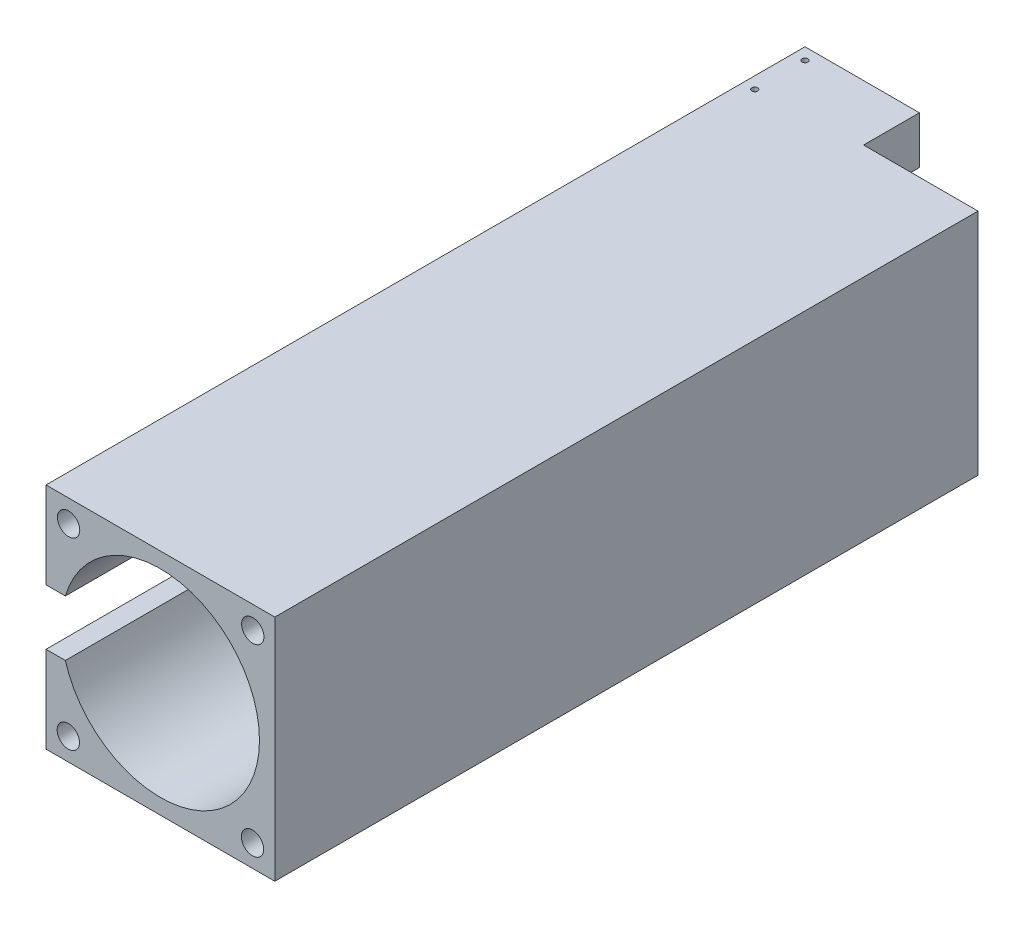
ISO-10303-21;
HEADER;
FILE_DESCRIPTION(('STEP AP214'),'2;1');
FILE_NAME('part.step','',(''),(''),'','','');
FILE_SCHEMA(('AUTOMOTIVE_DESIGN { 1 0 10303 214 1 1 1 1 }'));
ENDSEC;
DATA;
#1=APPLICATION_CONTEXT('core data for automotive mechanical design processes');
#2=APPLICATION_PROTOCOL_DEFINITION('international standard','automotive_design',2000,#1);
#3=PRODUCT_CONTEXT('',#1,'mechanical');
#4=PRODUCT('Part','Part','',(#3));
#5=PRODUCT_RELATED_PRODUCT_CATEGORY('part','',(#4));
#6=PRODUCT_DEFINITION_FORMATION('','',#4);
#7=PRODUCT_DEFINITION_CONTEXT('part definition',#1,'design');
#8=PRODUCT_DEFINITION('design','',#6,#7);
#9=PRODUCT_DEFINITION_SHAPE('','',#8);
#10=(LENGTH_UNIT() NAMED_UNIT(*) SI_UNIT(.MILLI.,.METRE.));
#11=(NAMED_UNIT(*) PLANE_ANGLE_UNIT() SI_UNIT($,.RADIAN.));
#12=(NAMED_UNIT(*) SI_UNIT($,.STERADIAN.) SOLID_ANGLE_UNIT());
#13=UNCERTAINTY_MEASURE_WITH_UNIT(LENGTH_MEASURE(1.E-05),#10,'distance_accuracy_value','');
#14=(GEOMETRIC_REPRESENTATION_CONTEXT(3) GLOBAL_UNCERTAINTY_ASSIGNED_CONTEXT((#13)) GLOBAL_UNIT_ASSIGNED_CONTEXT((#10,
#11,#12)) REPRESENTATION_CONTEXT('',''));
#15=CARTESIAN_POINT('',(0.,0.,0.));
#16=DIRECTION('',(0.,0.,1.));
#17=DIRECTION('',(1.,0.,0.));
#18=AXIS2_PLACEMENT_3D('',#15,#16,#17);
#19=CARTESIAN_POINT('',(-41.,-41.,245.));
#20=DIRECTION('',(1.,0.,0.));
#21=DIRECTION('',(0.,0.,-1.));
#22=AXIS2_PLACEMENT_3D('',#19,#20,#21);
#23=PLANE('',#22);
#24=DIRECTION('',(0.,0.,1.));
#25=VECTOR('',#24,1.);
#26=CARTESIAN_POINT('',(-41.,24.,-27.));
#27=LINE('',#26,#25);
#28=CARTESIAN_POINT('',(-41.,24.,-27.));
#29=VERTEX_POINT('',#28);
#30=CARTESIAN_POINT('',(-41.,24.,-7.));
#31=VERTEX_POINT('',#30);
#32=EDGE_CURVE('E430',#29,#31,#27,.T.);
#33=ORIENTED_EDGE('',*,*,#32,.T.);
#34=DIRECTION('',(0.,-1.,0.));
#35=VECTOR('',#34,1.);
#36=CARTESIAN_POINT('',(-41.,-41.,-7.));
#37=LINE('',#36,#35);
#38=CARTESIAN_POINT('',(-41.,-41.,-7.));
#39=VERTEX_POINT('',#38);
#40=EDGE_CURVE('E144',#31,#39,#37,.T.);
#41=ORIENTED_EDGE('',*,*,#40,.T.);
#42=DIRECTION('',(0.,0.,-1.));
#43=VECTOR('',#42,1.);
#44=CARTESIAN_POINT('',(-41.,-41.,245.));
#45=LINE('',#44,#43);
#46=CARTESIAN_POINT('',(-41.,-41.,245.));
#47=VERTEX_POINT('',#46);
#48=EDGE_CURVE('E232',#47,#39,#45,.T.);
#49=ORIENTED_EDGE('',*,*,#48,.F.);
#50=DIRECTION('',(0.,-1.,0.));
#51=VECTOR('',#50,1.);
#52=CARTESIAN_POINT('',(-41.,-41.,245.));
#53=LINE('',#52,#51);
#54=CARTESIAN_POINT('',(-41.,-10.,245.));
#55=VERTEX_POINT('',#54);
#56=EDGE_CURVE('E211',#55,#47,#53,.T.);
#57=ORIENTED_EDGE('',*,*,#56,.F.);
#58=DIRECTION('',(0.,0.,1.));
#59=VECTOR('',#58,1.);
#60=CARTESIAN_POINT('',(-41.,-10.,-21.540659228538));
#61=LINE('',#60,#59);
#62=CARTESIAN_POINT('',(-41.,-10.,0.));
#63=VERTEX_POINT('',#62);
#64=EDGE_CURVE('E192',#63,#55,#61,.T.);
#65=ORIENTED_EDGE('',*,*,#64,.F.);
#66=DIRECTION('',(0.,-1.,0.));
#67=VECTOR('',#66,1.);
#68=CARTESIAN_POINT('',(-41.,10.,0.));
#69=LINE('',#68,#67);
#70=CARTESIAN_POINT('',(-41.,10.,0.));
#71=VERTEX_POINT('',#70);
#72=EDGE_CURVE('E189',#71,#63,#69,.T.);
#73=ORIENTED_EDGE('',*,*,#72,.F.);
#74=DIRECTION('',(0.,0.,1.));
#75=VECTOR('',#74,1.);
#76=CARTESIAN_POINT('',(-41.,10.,-21.540659228538));
#77=LINE('',#76,#75);
#78=CARTESIAN_POINT('',(-41.,10.,245.));
#79=VERTEX_POINT('',#78);
#80=EDGE_CURVE('E193',#71,#79,#77,.T.);
#81=ORIENTED_EDGE('',*,*,#80,.T.);
#82=CARTESIAN_POINT('',(-41.,41.,245.));
#83=VERTEX_POINT('',#82);
#84=EDGE_CURVE('E214',#83,#79,#53,.T.);
#85=ORIENTED_EDGE('',*,*,#84,.F.);
#86=DIRECTION('',(0.,0.,-1.));
#87=VECTOR('',#86,1.);
#88=CARTESIAN_POINT('',(-41.,41.,245.));
#89=LINE('',#88,#87);
#90=CARTESIAN_POINT('',(-41.,41.,-27.));
#91=VERTEX_POINT('',#90);
#92=EDGE_CURVE('E223',#83,#91,#89,.T.);
#93=ORIENTED_EDGE('',*,*,#92,.T.);
#94=DIRECTION('',(0.,1.,0.));
#95=VECTOR('',#94,1.);
#96=CARTESIAN_POINT('',(-41.,41.,-27.));
#97=LINE('',#96,#95);
#98=EDGE_CURVE('E202',#29,#91,#97,.T.);
#99=ORIENTED_EDGE('',*,*,#98,.F.);
#100=EDGE_LOOP('',(#33,#41,#49,#57,#65,#73,#81,#85,#93,#99));
#101=FACE_BOUND('',#100,.T.);
#102=ADVANCED_FACE('F39',(#101),#23,.F.);
#103=CARTESIAN_POINT('',(-41.,-41.,245.));
#104=DIRECTION('',(0.,1.,0.));
#105=DIRECTION('',(0.,0.,1.));
#106=AXIS2_PLACEMENT_3D('',#103,#104,#105);
#107=PLANE('',#106);
#108=DIRECTION('',(-1.,0.,0.));
#109=VECTOR('',#108,1.);
#110=CARTESIAN_POINT('',(41.001,-41.,-7.));
#111=LINE('',#110,#109);
#112=CARTESIAN_POINT('',(41.,-41.,-7.));
#113=VERTEX_POINT('',#112);
#114=EDGE_CURVE('E146',#113,#39,#111,.T.);
#115=ORIENTED_EDGE('',*,*,#114,.F.);
#116=DIRECTION('',(0.,0.,-1.));
#117=VECTOR('',#116,1.);
#118=CARTESIAN_POINT('',(41.,-41.,245.));
#119=LINE('',#118,#117);
#120=CARTESIAN_POINT('',(41.,-41.,245.));
#121=VERTEX_POINT('',#120);
#122=EDGE_CURVE('E229',#121,#113,#119,.T.);
#123=ORIENTED_EDGE('',*,*,#122,.F.);
#124=DIRECTION('',(1.,0.,0.));
#125=VECTOR('',#124,1.);
#126=CARTESIAN_POINT('',(-41.,-41.,245.));
#127=LINE('',#126,#125);
#128=EDGE_CURVE('E217',#47,#121,#127,.T.);
#129=ORIENTED_EDGE('',*,*,#128,.F.);
#130=ORIENTED_EDGE('',*,*,#48,.T.);
#131=EDGE_LOOP('',(#115,#123,#129,#130));
#132=FACE_BOUND('',#131,.T.);
#133=ADVANCED_FACE('F344',(#132),#107,.F.);
#134=CARTESIAN_POINT('',(41.,-41.,245.));
#135=DIRECTION('',(-1.,0.,0.));
#136=DIRECTION('',(0.,0.,1.));
#137=AXIS2_PLACEMENT_3D('',#134,#135,#136);
#138=PLANE('',#137);
#139=DIRECTION('',(0.,1.,0.));
#140=VECTOR('',#139,1.);
#141=CARTESIAN_POINT('',(41.,-41.,-7.));
#142=LINE('',#141,#140);
#143=CARTESIAN_POINT('',(41.,41.,-7.));
#144=VERTEX_POINT('',#143);
#145=EDGE_CURVE('E133',#113,#144,#142,.T.);
#146=ORIENTED_EDGE('',*,*,#145,.T.);
#147=DIRECTION('',(0.,0.,-1.));
#148=VECTOR('',#147,1.);
#149=CARTESIAN_POINT('',(41.,41.,245.));
#150=LINE('',#149,#148);
#151=CARTESIAN_POINT('',(41.,41.,245.));
#152=VERTEX_POINT('',#151);
#153=EDGE_CURVE('E226',#152,#144,#150,.T.);
#154=ORIENTED_EDGE('',*,*,#153,.F.);
#155=DIRECTION('',(0.,1.,0.));
#156=VECTOR('',#155,1.);
#157=CARTESIAN_POINT('',(41.,-41.,245.));
#158=LINE('',#157,#156);
#159=EDGE_CURVE('E219',#121,#152,#158,.T.);
#160=ORIENTED_EDGE('',*,*,#159,.F.);
#161=ORIENTED_EDGE('',*,*,#122,.T.);
#162=EDGE_LOOP('',(#146,#154,#160,#161));
#163=FACE_BOUND('',#162,.T.);
#164=ADVANCED_FACE('F350',(#163),#138,.F.);
#165=CARTESIAN_POINT('',(0.,0.,-27.));
#166=DIRECTION('',(0.,0.,-1.));
#167=DIRECTION('',(-1.,0.,0.));
#168=AXIS2_PLACEMENT_3D('',#165,#166,#167);
#169=PLANE('',#168);
#170=DIRECTION('',(0.,1.,0.));
#171=VECTOR('',#170,1.);
#172=CARTESIAN_POINT('',(0.,-41.001,-27.));
#173=LINE('',#172,#171);
#174=CARTESIAN_POINT('',(0.,24.,-27.));
#175=VERTEX_POINT('',#174);
#176=CARTESIAN_POINT('',(0.,41.,-27.));
#177=VERTEX_POINT('',#176);
#178=EDGE_CURVE('E134',#175,#177,#173,.T.);
#179=ORIENTED_EDGE('',*,*,#178,.F.);
#180=DIRECTION('',(-1.,0.,0.));
#181=VECTOR('',#180,1.);
#182=CARTESIAN_POINT('',(41.001,24.,-27.));
#183=LINE('',#182,#181);
#184=EDGE_CURVE('E55',#175,#29,#183,.T.);
#185=ORIENTED_EDGE('',*,*,#184,.T.);
#186=ORIENTED_EDGE('',*,*,#98,.T.);
#187=DIRECTION('',(1.,0.,0.));
#188=VECTOR('',#187,1.);
#189=CARTESIAN_POINT('',(41.,41.,-27.));
#190=LINE('',#189,#188);
#191=EDGE_CURVE('E204',#91,#177,#190,.T.);
#192=ORIENTED_EDGE('',*,*,#191,.T.);
#193=EDGE_LOOP('',(#179,#185,#186,#192));
#194=FACE_BOUND('',#193,.T.);
#195=ADVANCED_FACE('F404',(#194),#169,.T.);
#196=CARTESIAN_POINT('',(0.,0.,245.));
#197=DIRECTION('',(0.,0.,-1.));
#198=DIRECTION('',(-1.,0.,0.));
#199=AXIS2_PLACEMENT_3D('',#196,#197,#198);
#200=PLANE('',#199);
#201=CARTESIAN_POINT('',(-32.9999999999981,-33.,245.));
#202=DIRECTION('',(0.,0.,1.));
#203=DIRECTION('',(1.,0.,0.));
#204=AXIS2_PLACEMENT_3D('',#201,#202,#203);
#205=CIRCLE('',#204,4.000000000001);
#206=CARTESIAN_POINT('',(-28.9999999999971,-33.,245.));
#207=VERTEX_POINT('',#206);
#208=EDGE_CURVE('E162',#207,#207,#205,.T.);
#209=ORIENTED_EDGE('',*,*,#208,.F.);
#210=EDGE_LOOP('',(#209));
#211=FACE_BOUND('',#210,.T.);
#212=CARTESIAN_POINT('',(33.0000000000019,-33.0999999999982,245.));
#213=DIRECTION('',(0.,0.,1.));
#214=DIRECTION('',(1.,0.,0.));
#215=AXIS2_PLACEMENT_3D('',#212,#213,#214);
#216=CIRCLE('',#215,4.00000000000001);
#217=CARTESIAN_POINT('',(37.0000000000019,-33.0999999999982,245.));
#218=VERTEX_POINT('',#217);
#219=EDGE_CURVE('E175',#218,#218,#216,.T.);
#220=ORIENTED_EDGE('',*,*,#219,.F.);
#221=EDGE_LOOP('',(#220));
#222=FACE_BOUND('',#221,.T.);
#223=CARTESIAN_POINT('',(33.1000000000001,32.9000000000018,245.));
#224=DIRECTION('',(0.,0.,1.));
#225=DIRECTION('',(1.,0.,0.));
#226=AXIS2_PLACEMENT_3D('',#223,#224,#225);
#227=CIRCLE('',#226,4.);
#228=CARTESIAN_POINT('',(37.1000000000001,32.9000000000018,245.));
#229=VERTEX_POINT('',#228);
#230=EDGE_CURVE('E171',#229,#229,#227,.T.);
#231=ORIENTED_EDGE('',*,*,#230,.F.);
#232=EDGE_LOOP('',(#231));
#233=FACE_BOUND('',#232,.T.);
#234=CARTESIAN_POINT('',(-32.9,33.,245.));
#235=DIRECTION('',(0.,0.,1.));
#236=DIRECTION('',(1.,0.,0.));
#237=AXIS2_PLACEMENT_3D('',#234,#235,#236);
#238=CIRCLE('',#237,4.);
#239=CARTESIAN_POINT('',(-28.9,33.,245.));
#240=VERTEX_POINT('',#239);
#241=EDGE_CURVE('E174',#240,#240,#238,.T.);
#242=ORIENTED_EDGE('',*,*,#241,.F.);
#243=EDGE_LOOP('',(#242));
#244=FACE_BOUND('',#243,.T.);
#245=CARTESIAN_POINT('',(0.,0.,245.));
#246=DIRECTION('',(0.,0.,1.));
#247=DIRECTION('',(1.,0.,0.));
#248=AXIS2_PLACEMENT_3D('',#245,#246,#247);
#249=CIRCLE('',#248,35.5);
#250=CARTESIAN_POINT('',(-34.0624426605022,-10.,245.));
#251=VERTEX_POINT('',#250);
#252=CARTESIAN_POINT('',(-34.0624426605022,10.,245.));
#253=VERTEX_POINT('',#252);
#254=EDGE_CURVE('E208',#251,#253,#249,.T.);
#255=ORIENTED_EDGE('',*,*,#254,.F.);
#256=DIRECTION('',(1.,0.,0.));
#257=VECTOR('',#256,1.);
#258=CARTESIAN_POINT('',(-41.,-10.,245.));
#259=LINE('',#258,#257);
#260=EDGE_CURVE('E182',#55,#251,#259,.T.);
#261=ORIENTED_EDGE('',*,*,#260,.F.);
#262=ORIENTED_EDGE('',*,*,#56,.T.);
#263=ORIENTED_EDGE('',*,*,#128,.T.);
#264=ORIENTED_EDGE('',*,*,#159,.T.);
#265=DIRECTION('',(-1.,0.,0.));
#266=VECTOR('',#265,1.);
#267=CARTESIAN_POINT('',(-41.,41.,245.));
#268=LINE('',#267,#266);
#269=EDGE_CURVE('E221',#152,#83,#268,.T.);
#270=ORIENTED_EDGE('',*,*,#269,.T.);
#271=ORIENTED_EDGE('',*,*,#84,.T.);
#272=DIRECTION('',(-1.,0.,0.));
#273=VECTOR('',#272,1.);
#274=CARTESIAN_POINT('',(-41.,10.,245.));
#275=LINE('',#274,#273);
#276=EDGE_CURVE('E183',#253,#79,#275,.T.);
#277=ORIENTED_EDGE('',*,*,#276,.F.);
#278=EDGE_LOOP('',(#255,#261,#262,#263,#264,#270,#271,#277));
#279=FACE_BOUND('',#278,.T.);
#280=ADVANCED_FACE('F407',(#211,#222,#233,#244,#279),#200,.F.);
#281=CARTESIAN_POINT('',(-41.,41.,245.));
#282=DIRECTION('',(0.,-1.,0.));
#283=DIRECTION('',(0.,0.,-1.));
#284=AXIS2_PLACEMENT_3D('',#281,#282,#283);
#285=PLANE('',#284);
#286=CARTESIAN_POINT('',(-36.75,41.,-22.75));
#287=DIRECTION('',(0.,1.,0.));
#288=DIRECTION('',(0.,0.,1.));
#289=AXIS2_PLACEMENT_3D('',#286,#287,#288);
#290=CIRCLE('',#289,1.05);
#291=CARTESIAN_POINT('',(-36.75,41.,-21.7));
#292=VERTEX_POINT('',#291);
#293=EDGE_CURVE('E163',#292,#292,#290,.T.);
#294=ORIENTED_EDGE('',*,*,#293,.F.);
#295=EDGE_LOOP('',(#294));
#296=FACE_BOUND('',#295,.T.);
#297=CARTESIAN_POINT('',(-36.75,41.,-4.74999999999999));
#298=DIRECTION('',(0.,1.,0.));
#299=DIRECTION('',(0.,0.,1.));
#300=AXIS2_PLACEMENT_3D('',#297,#298,#299);
#301=CIRCLE('',#300,1.05);
#302=CARTESIAN_POINT('',(-36.75,41.,-3.69999999999999));
#303=VERTEX_POINT('',#302);
#304=EDGE_CURVE('E158',#303,#303,#301,.T.);
#305=ORIENTED_EDGE('',*,*,#304,.F.);
#306=EDGE_LOOP('',(#305));
#307=FACE_BOUND('',#306,.T.);
#308=ORIENTED_EDGE('',*,*,#153,.T.);
#309=DIRECTION('',(1.,0.,0.));
#310=VECTOR('',#309,1.);
#311=CARTESIAN_POINT('',(41.,41.,-7.));
#312=LINE('',#311,#310);
#313=CARTESIAN_POINT('',(0.,41.,-7.));
#314=VERTEX_POINT('',#313);
#315=EDGE_CURVE('E432',#314,#144,#312,.T.);
#316=ORIENTED_EDGE('',*,*,#315,.F.);
#317=DIRECTION('',(0.,0.,1.));
#318=VECTOR('',#317,1.);
#319=CARTESIAN_POINT('',(0.,41.,-27.));
#320=LINE('',#319,#318);
#321=EDGE_CURVE('E128',#177,#314,#320,.T.);
#322=ORIENTED_EDGE('',*,*,#321,.F.);
#323=ORIENTED_EDGE('',*,*,#191,.F.);
#324=ORIENTED_EDGE('',*,*,#92,.F.);
#325=ORIENTED_EDGE('',*,*,#269,.F.);
#326=EDGE_LOOP('',(#308,#316,#322,#323,#324,#325));
#327=FACE_BOUND('',#326,.T.);
#328=ADVANCED_FACE('F414',(#296,#307,#327),#285,.F.);
#329=CARTESIAN_POINT('',(0.,0.,245.));
#330=DIRECTION('',(0.,0.,-1.));
#331=DIRECTION('',(-1.,0.,0.));
#332=AXIS2_PLACEMENT_3D('',#329,#330,#331);
#333=CYLINDRICAL_SURFACE('',#332,35.5);
#334=DIRECTION('',(0.,0.,-1.));
#335=VECTOR('',#334,1.);
#336=CARTESIAN_POINT('',(-34.0624426605022,-10.,245.));
#337=LINE('',#336,#335);
#338=CARTESIAN_POINT('',(-34.0624426605022,-10.,0.));
#339=VERTEX_POINT('',#338);
#340=EDGE_CURVE('E200',#251,#339,#337,.T.);
#341=ORIENTED_EDGE('',*,*,#340,.F.);
#342=ORIENTED_EDGE('',*,*,#254,.T.);
#343=DIRECTION('',(0.,0.,-1.));
#344=VECTOR('',#343,1.);
#345=CARTESIAN_POINT('',(-34.0624426605022,10.,245.));
#346=LINE('',#345,#344);
#347=CARTESIAN_POINT('',(-34.0624426605022,10.,0.));
#348=VERTEX_POINT('',#347);
#349=EDGE_CURVE('E198',#348,#253,#346,.F.);
#350=ORIENTED_EDGE('',*,*,#349,.F.);
#351=CARTESIAN_POINT('',(0.,0.,0.));
#352=DIRECTION('',(0.,0.,1.));
#353=DIRECTION('',(1.,0.,0.));
#354=AXIS2_PLACEMENT_3D('',#351,#352,#353);
#355=CIRCLE('',#354,35.5);
#356=EDGE_CURVE('E207',#339,#348,#355,.T.);
#357=ORIENTED_EDGE('',*,*,#356,.F.);
#358=EDGE_LOOP('',(#341,#342,#350,#357));
#359=FACE_BOUND('',#358,.T.);
#360=ADVANCED_FACE('F410',(#359),#333,.F.);
#361=CARTESIAN_POINT('',(0.,0.,0.));
#362=DIRECTION('',(0.,0.,-1.));
#363=DIRECTION('',(-1.,0.,0.));
#364=AXIS2_PLACEMENT_3D('',#361,#362,#363);
#365=PLANE('',#364);
#366=ORIENTED_EDGE('',*,*,#356,.T.);
#367=DIRECTION('',(-1.,0.,0.));
#368=VECTOR('',#367,1.);
#369=CARTESIAN_POINT('',(-41.,10.,0.));
#370=LINE('',#369,#368);
#371=EDGE_CURVE('E63',#348,#71,#370,.T.);
#372=ORIENTED_EDGE('',*,*,#371,.T.);
#373=ORIENTED_EDGE('',*,*,#72,.T.);
#374=DIRECTION('',(1.,0.,0.));
#375=VECTOR('',#374,1.);
#376=CARTESIAN_POINT('',(-41.,-10.,0.));
#377=LINE('',#376,#375);
#378=EDGE_CURVE('E185',#63,#339,#377,.T.);
#379=ORIENTED_EDGE('',*,*,#378,.T.);
#380=EDGE_LOOP('',(#366,#372,#373,#379));
#381=FACE_BOUND('',#380,.T.);
#382=ADVANCED_FACE('F402',(#381),#365,.F.);
#383=CARTESIAN_POINT('',(-41.,-10.,-21.540659228538));
#384=DIRECTION('',(0.,-1.,0.));
#385=DIRECTION('',(0.,0.,-1.));
#386=AXIS2_PLACEMENT_3D('',#383,#384,#385);
#387=PLANE('',#386);
#388=ORIENTED_EDGE('',*,*,#340,.T.);
#389=ORIENTED_EDGE('',*,*,#378,.F.);
#390=ORIENTED_EDGE('',*,*,#64,.T.);
#391=ORIENTED_EDGE('',*,*,#260,.T.);
#392=EDGE_LOOP('',(#388,#389,#390,#391));
#393=FACE_BOUND('',#392,.T.);
#394=ADVANCED_FACE('F399',(#393),#387,.F.);
#395=CARTESIAN_POINT('',(-41.,10.,-21.540659228538));
#396=DIRECTION('',(0.,1.,0.));
#397=DIRECTION('',(0.,0.,1.));
#398=AXIS2_PLACEMENT_3D('',#395,#396,#397);
#399=PLANE('',#398);
#400=ORIENTED_EDGE('',*,*,#349,.T.);
#401=ORIENTED_EDGE('',*,*,#276,.T.);
#402=ORIENTED_EDGE('',*,*,#80,.F.);
#403=ORIENTED_EDGE('',*,*,#371,.F.);
#404=EDGE_LOOP('',(#400,#401,#402,#403));
#405=FACE_BOUND('',#404,.T.);
#406=ADVANCED_FACE('F395',(#405),#399,.F.);
#407=CARTESIAN_POINT('',(-32.9,33.,225.));
#408=DIRECTION('',(0.,0.,1.));
#409=DIRECTION('',(1.,0.,0.));
#410=AXIS2_PLACEMENT_3D('',#407,#408,#409);
#411=CYLINDRICAL_SURFACE('',#410,4.);
#412=CARTESIAN_POINT('',(-32.9,33.,228.));
#413=DIRECTION('',(0.,0.,1.));
#414=DIRECTION('',(1.,0.,0.));
#415=AXIS2_PLACEMENT_3D('',#412,#413,#414);
#416=CIRCLE('',#415,4.);
#417=CARTESIAN_POINT('',(-28.9,33.,228.));
#418=VERTEX_POINT('',#417);
#419=EDGE_CURVE('E238',#418,#418,#416,.F.);
#420=ORIENTED_EDGE('',*,*,#419,.T.);
#421=EDGE_LOOP('',(#420));
#422=FACE_BOUND('',#421,.T.);
#423=ORIENTED_EDGE('',*,*,#241,.T.);
#424=EDGE_LOOP('',(#423));
#425=FACE_BOUND('',#424,.T.);
#426=ADVANCED_FACE('F391',(#422,#425),#411,.F.);
#427=CARTESIAN_POINT('',(-32.9,33.,225.));
#428=DIRECTION('',(0.,0.,1.));
#429=DIRECTION('',(1.,0.,0.));
#430=AXIS2_PLACEMENT_3D('',#427,#428,#429);
#431=PLANE('',#430);
#432=CARTESIAN_POINT('',(-32.9,33.,225.));
#433=DIRECTION('',(0.,0.,1.));
#434=DIRECTION('',(1.,0.,0.));
#435=AXIS2_PLACEMENT_3D('',#432,#433,#434);
#436=CIRCLE('',#435,1.);
#437=CARTESIAN_POINT('',(-31.9,33.,225.));
#438=VERTEX_POINT('',#437);
#439=EDGE_CURVE('E235',#438,#438,#436,.T.);
#440=ORIENTED_EDGE('',*,*,#439,.T.);
#441=EDGE_LOOP('',(#440));
#442=FACE_BOUND('',#441,.T.);
#443=ADVANCED_FACE('F387',(#442),#431,.T.);
#444=CARTESIAN_POINT('',(33.1000000000001,32.9000000000018,225.));
#445=DIRECTION('',(0.,0.,1.));
#446=DIRECTION('',(1.,0.,0.));
#447=AXIS2_PLACEMENT_3D('',#444,#445,#446);
#448=CYLINDRICAL_SURFACE('',#447,4.);
#449=CARTESIAN_POINT('',(33.1000000000001,32.9000000000018,228.));
#450=DIRECTION('',(0.,0.,1.));
#451=DIRECTION('',(1.,0.,0.));
#452=AXIS2_PLACEMENT_3D('',#449,#450,#451);
#453=CIRCLE('',#452,4.);
#454=CARTESIAN_POINT('',(37.1000000000001,32.9000000000018,228.));
#455=VERTEX_POINT('',#454);
#456=EDGE_CURVE('E244',#455,#455,#453,.F.);
#457=ORIENTED_EDGE('',*,*,#456,.T.);
#458=EDGE_LOOP('',(#457));
#459=FACE_BOUND('',#458,.T.);
#460=ORIENTED_EDGE('',*,*,#230,.T.);
#461=EDGE_LOOP('',(#460));
#462=FACE_BOUND('',#461,.T.);
#463=ADVANCED_FACE('F390',(#459,#462),#448,.F.);
#464=CARTESIAN_POINT('',(33.1000000000001,32.9000000000018,225.));
#465=DIRECTION('',(0.,0.,1.));
#466=DIRECTION('',(1.,0.,0.));
#467=AXIS2_PLACEMENT_3D('',#464,#465,#466);
#468=PLANE('',#467);
#469=CARTESIAN_POINT('',(33.1000000000001,32.9000000000018,225.));
#470=DIRECTION('',(0.,0.,1.));
#471=DIRECTION('',(1.,0.,0.));
#472=AXIS2_PLACEMENT_3D('',#469,#470,#471);
#473=CIRCLE('',#472,0.999999999999997);
#474=CARTESIAN_POINT('',(34.1,32.9000000000018,225.));
#475=VERTEX_POINT('',#474);
#476=EDGE_CURVE('E241',#475,#475,#473,.T.);
#477=ORIENTED_EDGE('',*,*,#476,.T.);
#478=EDGE_LOOP('',(#477));
#479=FACE_BOUND('',#478,.T.);
#480=ADVANCED_FACE('F536',(#479),#468,.T.);
#481=CARTESIAN_POINT('',(33.0000000000019,-33.0999999999982,225.));
#482=DIRECTION('',(0.,0.,1.));
#483=DIRECTION('',(1.,0.,0.));
#484=AXIS2_PLACEMENT_3D('',#481,#482,#483);
#485=CYLINDRICAL_SURFACE('',#484,4.00000000000001);
#486=CARTESIAN_POINT('',(33.0000000000019,-33.0999999999982,228.));
#487=DIRECTION('',(0.,0.,1.));
#488=DIRECTION('',(1.,0.,0.));
#489=AXIS2_PLACEMENT_3D('',#486,#487,#488);
#490=CIRCLE('',#489,4.00000000000001);
#491=CARTESIAN_POINT('',(37.0000000000019,-33.0999999999982,228.));
#492=VERTEX_POINT('',#491);
#493=EDGE_CURVE('E256',#492,#492,#490,.F.);
#494=ORIENTED_EDGE('',*,*,#493,.T.);
#495=EDGE_LOOP('',(#494));
#496=FACE_BOUND('',#495,.T.);
#497=ORIENTED_EDGE('',*,*,#219,.T.);
#498=EDGE_LOOP('',(#497));
#499=FACE_BOUND('',#498,.T.);
#500=ADVANCED_FACE('F384',(#496,#499),#485,.F.);
#501=CARTESIAN_POINT('',(33.0000000000019,-33.0999999999982,225.));
#502=DIRECTION('',(0.,0.,1.));
#503=DIRECTION('',(1.,0.,0.));
#504=AXIS2_PLACEMENT_3D('',#501,#502,#503);
#505=PLANE('',#504);
#506=CARTESIAN_POINT('',(33.0000000000019,-33.0999999999982,225.));
#507=DIRECTION('',(0.,0.,1.));
#508=DIRECTION('',(1.,0.,0.));
#509=AXIS2_PLACEMENT_3D('',#506,#507,#508);
#510=CIRCLE('',#509,1.00000000000001);
#511=CARTESIAN_POINT('',(34.0000000000019,-33.0999999999982,225.));
#512=VERTEX_POINT('',#511);
#513=EDGE_CURVE('E253',#512,#512,#510,.T.);
#514=ORIENTED_EDGE('',*,*,#513,.T.);
#515=EDGE_LOOP('',(#514));
#516=FACE_BOUND('',#515,.T.);
#517=ADVANCED_FACE('F380',(#516),#505,.T.);
#518=CARTESIAN_POINT('',(-32.9999999999981,-33.,225.));
#519=DIRECTION('',(0.,0.,1.));
#520=DIRECTION('',(1.,0.,0.));
#521=AXIS2_PLACEMENT_3D('',#518,#519,#520);
#522=CYLINDRICAL_SURFACE('',#521,4.000000000001);
#523=CARTESIAN_POINT('',(-32.9999999999981,-33.,228.));
#524=DIRECTION('',(0.,0.,1.));
#525=DIRECTION('',(1.,0.,0.));
#526=AXIS2_PLACEMENT_3D('',#523,#524,#525);
#527=CIRCLE('',#526,4.000000000001);
#528=CARTESIAN_POINT('',(-28.9999999999971,-33.,228.));
#529=VERTEX_POINT('',#528);
#530=EDGE_CURVE('E250',#529,#529,#527,.F.);
#531=ORIENTED_EDGE('',*,*,#530,.T.);
#532=EDGE_LOOP('',(#531));
#533=FACE_BOUND('',#532,.T.);
#534=ORIENTED_EDGE('',*,*,#208,.T.);
#535=EDGE_LOOP('',(#534));
#536=FACE_BOUND('',#535,.T.);
#537=ADVANCED_FACE('F375',(#533,#536),#522,.F.);
#538=CARTESIAN_POINT('',(-32.9999999999981,-33.,225.));
#539=DIRECTION('',(0.,0.,1.));
#540=DIRECTION('',(1.,0.,0.));
#541=AXIS2_PLACEMENT_3D('',#538,#539,#540);
#542=PLANE('',#541);
#543=CARTESIAN_POINT('',(-32.9999999999981,-33.,225.));
#544=DIRECTION('',(0.,0.,1.));
#545=DIRECTION('',(1.,0.,0.));
#546=AXIS2_PLACEMENT_3D('',#543,#544,#545);
#547=CIRCLE('',#546,1.000000000001);
#548=CARTESIAN_POINT('',(-31.9999999999971,-33.,225.));
#549=VERTEX_POINT('',#548);
#550=EDGE_CURVE('E247',#549,#549,#547,.T.);
#551=ORIENTED_EDGE('',*,*,#550,.T.);
#552=EDGE_LOOP('',(#551));
#553=FACE_BOUND('',#552,.T.);
#554=ADVANCED_FACE('F359',(#553),#542,.T.);
#555=CARTESIAN_POINT('',(-32.9,33.,228.));
#556=DIRECTION('',(0.,0.,1.));
#557=DIRECTION('',(1.,0.,0.));
#558=AXIS2_PLACEMENT_3D('',#555,#556,#557);
#559=DEGENERATE_TOROIDAL_SURFACE('',#558,1.,3.,.T.);
#560=ORIENTED_EDGE('',*,*,#419,.F.);
#561=EDGE_LOOP('',(#560));
#562=FACE_BOUND('',#561,.T.);
#563=ORIENTED_EDGE('',*,*,#439,.F.);
#564=EDGE_LOOP('',(#563));
#565=FACE_BOUND('',#564,.T.);
#566=ADVANCED_FACE('F355',(#562,#565),#559,.F.);
#567=CARTESIAN_POINT('',(33.1000000000001,32.9000000000018,228.));
#568=DIRECTION('',(0.,0.,1.));
#569=DIRECTION('',(1.,0.,0.));
#570=AXIS2_PLACEMENT_3D('',#567,#568,#569);
#571=DEGENERATE_TOROIDAL_SURFACE('',#570,0.999999999999997,3.,.T.);
#572=ORIENTED_EDGE('',*,*,#456,.F.);
#573=EDGE_LOOP('',(#572));
#574=FACE_BOUND('',#573,.T.);
#575=ORIENTED_EDGE('',*,*,#476,.F.);
#576=EDGE_LOOP('',(#575));
#577=FACE_BOUND('',#576,.T.);
#578=ADVANCED_FACE('F358',(#574,#577),#571,.F.);
#579=CARTESIAN_POINT('',(-32.9999999999981,-33.,228.));
#580=DIRECTION('',(0.,0.,1.));
#581=DIRECTION('',(1.,0.,0.));
#582=AXIS2_PLACEMENT_3D('',#579,#580,#581);
#583=DEGENERATE_TOROIDAL_SURFACE('',#582,1.000000000001,3.,.T.);
#584=ORIENTED_EDGE('',*,*,#530,.F.);
#585=EDGE_LOOP('',(#584));
#586=FACE_BOUND('',#585,.T.);
#587=ORIENTED_EDGE('',*,*,#550,.F.);
#588=EDGE_LOOP('',(#587));
#589=FACE_BOUND('',#588,.T.);
#590=ADVANCED_FACE('F362',(#586,#589),#583,.F.);
#591=CARTESIAN_POINT('',(33.0000000000019,-33.0999999999982,228.));
#592=DIRECTION('',(0.,0.,1.));
#593=DIRECTION('',(1.,0.,0.));
#594=AXIS2_PLACEMENT_3D('',#591,#592,#593);
#595=DEGENERATE_TOROIDAL_SURFACE('',#594,1.00000000000001,3.,.T.);
#596=ORIENTED_EDGE('',*,*,#493,.F.);
#597=EDGE_LOOP('',(#596));
#598=FACE_BOUND('',#597,.T.);
#599=ORIENTED_EDGE('',*,*,#513,.F.);
#600=EDGE_LOOP('',(#599));
#601=FACE_BOUND('',#600,.T.);
#602=ADVANCED_FACE('F41',(#598,#601),#595,.F.);
#603=CARTESIAN_POINT('',(-36.75,31.,-4.74999999999999));
#604=DIRECTION('',(0.,1.,0.));
#605=DIRECTION('',(0.,0.,1.));
#606=AXIS2_PLACEMENT_3D('',#603,#604,#605);
#607=CYLINDRICAL_SURFACE('',#606,1.05);
#608=CARTESIAN_POINT('',(-36.75,35.2,-4.74999999999999));
#609=DIRECTION('',(0.,1.,0.));
#610=DIRECTION('',(0.,0.,1.));
#611=AXIS2_PLACEMENT_3D('',#608,#609,#610);
#612=CIRCLE('',#611,1.05);
#613=CARTESIAN_POINT('',(-36.75,35.2,-3.69999999999999));
#614=VERTEX_POINT('',#613);
#615=EDGE_CURVE('E148',#614,#614,#612,.T.);
#616=ORIENTED_EDGE('',*,*,#615,.F.);
#617=EDGE_LOOP('',(#616));
#618=FACE_BOUND('',#617,.T.);
#619=ORIENTED_EDGE('',*,*,#304,.T.);
#620=EDGE_LOOP('',(#619));
#621=FACE_BOUND('',#620,.T.);
#622=ADVANCED_FACE('F280',(#618,#621),#607,.F.);
#623=CARTESIAN_POINT('',(-36.75,31.,-22.75));
#624=DIRECTION('',(0.,1.,0.));
#625=DIRECTION('',(0.,0.,1.));
#626=AXIS2_PLACEMENT_3D('',#623,#624,#625);
#627=CYLINDRICAL_SURFACE('',#626,1.05);
#628=CARTESIAN_POINT('',(-36.75,35.2,-22.75));
#629=DIRECTION('',(0.,1.,0.));
#630=DIRECTION('',(0.,0.,1.));
#631=AXIS2_PLACEMENT_3D('',#628,#629,#630);
#632=CIRCLE('',#631,1.05);
#633=CARTESIAN_POINT('',(-36.75,35.2,-21.7));
#634=VERTEX_POINT('',#633);
#635=EDGE_CURVE('E155',#634,#634,#632,.T.);
#636=ORIENTED_EDGE('',*,*,#635,.F.);
#637=EDGE_LOOP('',(#636));
#638=FACE_BOUND('',#637,.T.);
#639=ORIENTED_EDGE('',*,*,#293,.T.);
#640=EDGE_LOOP('',(#639));
#641=FACE_BOUND('',#640,.T.);
#642=ADVANCED_FACE('F269',(#638,#641),#627,.F.);
#643=CARTESIAN_POINT('',(-36.75,35.2,-22.75));
#644=DIRECTION('',(0.,1.,0.));
#645=DIRECTION('',(0.,0.,1.));
#646=AXIS2_PLACEMENT_3D('',#643,#644,#645);
#647=PLANE('',#646);
#648=ORIENTED_EDGE('',*,*,#635,.T.);
#649=EDGE_LOOP('',(#648));
#650=FACE_BOUND('',#649,.T.);
#651=ADVANCED_FACE('F279',(#650),#647,.T.);
#652=CARTESIAN_POINT('',(-36.75,35.2,-4.74999999999999));
#653=DIRECTION('',(0.,1.,0.));
#654=DIRECTION('',(0.,0.,1.));
#655=AXIS2_PLACEMENT_3D('',#652,#653,#654);
#656=PLANE('',#655);
#657=ORIENTED_EDGE('',*,*,#615,.T.);
#658=EDGE_LOOP('',(#657));
#659=FACE_BOUND('',#658,.T.);
#660=ADVANCED_FACE('F291',(#659),#656,.T.);
#661=CARTESIAN_POINT('',(41.001,24.,-27.));
#662=DIRECTION('',(0.,-1.,0.));
#663=DIRECTION('',(0.,0.,-1.));
#664=AXIS2_PLACEMENT_3D('',#661,#662,#663);
#665=PLANE('',#664);
#666=DIRECTION('',(0.,0.,1.));
#667=VECTOR('',#666,1.);
#668=CARTESIAN_POINT('',(0.,24.,-27.));
#669=LINE('',#668,#667);
#670=CARTESIAN_POINT('',(0.,24.,-7.));
#671=VERTEX_POINT('',#670);
#672=EDGE_CURVE('E126',#175,#671,#669,.T.);
#673=ORIENTED_EDGE('',*,*,#672,.T.);
#674=DIRECTION('',(-1.,0.,0.));
#675=VECTOR('',#674,1.);
#676=CARTESIAN_POINT('',(41.001,24.,-7.));
#677=LINE('',#676,#675);
#678=EDGE_CURVE('E138',#671,#31,#677,.T.);
#679=ORIENTED_EDGE('',*,*,#678,.T.);
#680=ORIENTED_EDGE('',*,*,#32,.F.);
#681=ORIENTED_EDGE('',*,*,#184,.F.);
#682=EDGE_LOOP('',(#673,#679,#680,#681));
#683=FACE_BOUND('',#682,.T.);
#684=ADVANCED_FACE('F137',(#683),#665,.T.);
#685=CARTESIAN_POINT('',(41.001,-41.,-7.));
#686=DIRECTION('',(0.,0.,-1.));
#687=DIRECTION('',(-1.,0.,0.));
#688=AXIS2_PLACEMENT_3D('',#685,#686,#687);
#689=PLANE('',#688);
#690=CARTESIAN_POINT('',(33.,33.,-7.));
#691=DIRECTION('',(0.,0.,-1.));
#692=DIRECTION('',(-1.,0.,0.));
#693=AXIS2_PLACEMENT_3D('',#690,#691,#692);
#694=CIRCLE('',#693,1.2);
#695=CARTESIAN_POINT('',(31.8,33.,-7.));
#696=VERTEX_POINT('',#695);
#697=EDGE_CURVE('E468',#696,#696,#694,.T.);
#698=ORIENTED_EDGE('',*,*,#697,.F.);
#699=EDGE_LOOP('',(#698));
#700=FACE_BOUND('',#699,.T.);
#701=CARTESIAN_POINT('',(33.,-33.,-7.));
#702=DIRECTION('',(0.,0.,-1.));
#703=DIRECTION('',(-1.,0.,0.));
#704=AXIS2_PLACEMENT_3D('',#701,#702,#703);
#705=CIRCLE('',#704,1.2);
#706=CARTESIAN_POINT('',(31.8,-33.,-7.));
#707=VERTEX_POINT('',#706);
#708=EDGE_CURVE('E462',#707,#707,#705,.T.);
#709=ORIENTED_EDGE('',*,*,#708,.F.);
#710=EDGE_LOOP('',(#709));
#711=FACE_BOUND('',#710,.T.);
#712=CARTESIAN_POINT('',(-33.,-33.,-7.));
#713=DIRECTION('',(0.,0.,-1.));
#714=DIRECTION('',(-1.,0.,0.));
#715=AXIS2_PLACEMENT_3D('',#712,#713,#714);
#716=CIRCLE('',#715,1.2);
#717=CARTESIAN_POINT('',(-34.2,-33.,-7.));
#718=VERTEX_POINT('',#717);
#719=EDGE_CURVE('E456',#718,#718,#716,.T.);
#720=ORIENTED_EDGE('',*,*,#719,.F.);
#721=EDGE_LOOP('',(#720));
#722=FACE_BOUND('',#721,.T.);
#723=CARTESIAN_POINT('',(-38.,20.,-7.));
#724=DIRECTION('',(0.,0.,-1.));
#725=DIRECTION('',(-1.,0.,0.));
#726=AXIS2_PLACEMENT_3D('',#723,#724,#725);
#727=CIRCLE('',#726,1.2);
#728=CARTESIAN_POINT('',(-39.2,20.,-7.));
#729=VERTEX_POINT('',#728);
#730=EDGE_CURVE('E450',#729,#729,#727,.T.);
#731=ORIENTED_EDGE('',*,*,#730,.F.);
#732=EDGE_LOOP('',(#731));
#733=FACE_BOUND('',#732,.T.);
#734=ORIENTED_EDGE('',*,*,#114,.T.);
#735=ORIENTED_EDGE('',*,*,#40,.F.);
#736=ORIENTED_EDGE('',*,*,#678,.F.);
#737=DIRECTION('',(0.,1.,0.));
#738=VECTOR('',#737,1.);
#739=CARTESIAN_POINT('',(0.,-41.001,-7.));
#740=LINE('',#739,#738);
#741=EDGE_CURVE('E123',#671,#314,#740,.T.);
#742=ORIENTED_EDGE('',*,*,#741,.T.);
#743=ORIENTED_EDGE('',*,*,#315,.T.);
#744=ORIENTED_EDGE('',*,*,#145,.F.);
#745=EDGE_LOOP('',(#734,#735,#736,#742,#743,#744));
#746=FACE_BOUND('',#745,.T.);
#747=ADVANCED_FACE('F142',(#700,#711,#722,#733,#746),#689,.T.);
#748=CARTESIAN_POINT('',(0.,-41.001,-27.));
#749=DIRECTION('',(-1.,0.,0.));
#750=DIRECTION('',(0.,0.,1.));
#751=AXIS2_PLACEMENT_3D('',#748,#749,#750);
#752=PLANE('',#751);
#753=ORIENTED_EDGE('',*,*,#178,.T.);
#754=ORIENTED_EDGE('',*,*,#321,.T.);
#755=ORIENTED_EDGE('',*,*,#741,.F.);
#756=ORIENTED_EDGE('',*,*,#672,.F.);
#757=EDGE_LOOP('',(#753,#754,#755,#756));
#758=FACE_BOUND('',#757,.T.);
#759=ADVANCED_FACE('F125',(#758),#752,.F.);
#760=CARTESIAN_POINT('',(-38.,20.,3.));
#761=DIRECTION('',(0.,0.,-1.));
#762=DIRECTION('',(-1.,0.,0.));
#763=AXIS2_PLACEMENT_3D('',#760,#761,#762);
#764=CYLINDRICAL_SURFACE('',#763,1.2);
#765=CARTESIAN_POINT('',(-38.,20.,3.));
#766=DIRECTION('',(0.,0.,-1.));
#767=DIRECTION('',(-1.,0.,0.));
#768=AXIS2_PLACEMENT_3D('',#765,#766,#767);
#769=CIRCLE('',#768,1.2);
#770=CARTESIAN_POINT('',(-39.2,20.,3.));
#771=VERTEX_POINT('',#770);
#772=EDGE_CURVE('E453',#771,#771,#769,.T.);
#773=ORIENTED_EDGE('',*,*,#772,.F.);
#774=EDGE_LOOP('',(#773));
#775=FACE_BOUND('',#774,.T.);
#776=ORIENTED_EDGE('',*,*,#730,.T.);
#777=EDGE_LOOP('',(#776));
#778=FACE_BOUND('',#777,.T.);
#779=ADVANCED_FACE('F309',(#775,#778),#764,.F.);
#780=CARTESIAN_POINT('',(-38.,20.,3.));
#781=DIRECTION('',(0.,0.,-1.));
#782=DIRECTION('',(-1.,0.,0.));
#783=AXIS2_PLACEMENT_3D('',#780,#781,#782);
#784=PLANE('',#783);
#785=ORIENTED_EDGE('',*,*,#772,.T.);
#786=EDGE_LOOP('',(#785));
#787=FACE_BOUND('',#786,.T.);
#788=ADVANCED_FACE('F312',(#787),#784,.T.);
#789=CARTESIAN_POINT('',(-33.,-33.,3.));
#790=DIRECTION('',(0.,0.,-1.));
#791=DIRECTION('',(-1.,0.,0.));
#792=AXIS2_PLACEMENT_3D('',#789,#790,#791);
#793=CYLINDRICAL_SURFACE('',#792,1.2);
#794=CARTESIAN_POINT('',(-33.,-33.,3.));
#795=DIRECTION('',(0.,0.,-1.));
#796=DIRECTION('',(-1.,0.,0.));
#797=AXIS2_PLACEMENT_3D('',#794,#795,#796);
#798=CIRCLE('',#797,1.2);
#799=CARTESIAN_POINT('',(-34.2,-33.,3.));
#800=VERTEX_POINT('',#799);
#801=EDGE_CURVE('E459',#800,#800,#798,.T.);
#802=ORIENTED_EDGE('',*,*,#801,.F.);
#803=EDGE_LOOP('',(#802));
#804=FACE_BOUND('',#803,.T.);
#805=ORIENTED_EDGE('',*,*,#719,.T.);
#806=EDGE_LOOP('',(#805));
#807=FACE_BOUND('',#806,.T.);
#808=ADVANCED_FACE('F316',(#804,#807),#793,.F.);
#809=CARTESIAN_POINT('',(-33.,-33.,3.));
#810=DIRECTION('',(0.,0.,-1.));
#811=DIRECTION('',(-1.,0.,0.));
#812=AXIS2_PLACEMENT_3D('',#809,#810,#811);
#813=PLANE('',#812);
#814=ORIENTED_EDGE('',*,*,#801,.T.);
#815=EDGE_LOOP('',(#814));
#816=FACE_BOUND('',#815,.T.);
#817=ADVANCED_FACE('F320',(#816),#813,.T.);
#818=CARTESIAN_POINT('',(33.,-33.,3.));
#819=DIRECTION('',(0.,0.,-1.));
#820=DIRECTION('',(-1.,0.,0.));
#821=AXIS2_PLACEMENT_3D('',#818,#819,#820);
#822=CYLINDRICAL_SURFACE('',#821,1.2);
#823=CARTESIAN_POINT('',(33.,-33.,3.));
#824=DIRECTION('',(0.,0.,-1.));
#825=DIRECTION('',(-1.,0.,0.));
#826=AXIS2_PLACEMENT_3D('',#823,#824,#825);
#827=CIRCLE('',#826,1.2);
#828=CARTESIAN_POINT('',(31.8,-33.,3.));
#829=VERTEX_POINT('',#828);
#830=EDGE_CURVE('E465',#829,#829,#827,.T.);
#831=ORIENTED_EDGE('',*,*,#830,.F.);
#832=EDGE_LOOP('',(#831));
#833=FACE_BOUND('',#832,.T.);
#834=ORIENTED_EDGE('',*,*,#708,.T.);
#835=EDGE_LOOP('',(#834));
#836=FACE_BOUND('',#835,.T.);
#837=ADVANCED_FACE('F324',(#833,#836),#822,.F.);
#838=CARTESIAN_POINT('',(33.,-33.,3.));
#839=DIRECTION('',(0.,0.,-1.));
#840=DIRECTION('',(-1.,0.,0.));
#841=AXIS2_PLACEMENT_3D('',#838,#839,#840);
#842=PLANE('',#841);
#843=ORIENTED_EDGE('',*,*,#830,.T.);
#844=EDGE_LOOP('',(#843));
#845=FACE_BOUND('',#844,.T.);
#846=ADVANCED_FACE('F328',(#845),#842,.T.);
#847=CARTESIAN_POINT('',(33.,33.,3.));
#848=DIRECTION('',(0.,0.,-1.));
#849=DIRECTION('',(-1.,0.,0.));
#850=AXIS2_PLACEMENT_3D('',#847,#848,#849);
#851=CYLINDRICAL_SURFACE('',#850,1.2);
#852=CARTESIAN_POINT('',(33.,33.,3.));
#853=DIRECTION('',(0.,0.,-1.));
#854=DIRECTION('',(-1.,0.,0.));
#855=AXIS2_PLACEMENT_3D('',#852,#853,#854);
#856=CIRCLE('',#855,1.2);
#857=CARTESIAN_POINT('',(31.8,33.,3.));
#858=VERTEX_POINT('',#857);
#859=EDGE_CURVE('E140',#858,#858,#856,.T.);
#860=ORIENTED_EDGE('',*,*,#859,.F.);
#861=EDGE_LOOP('',(#860));
#862=FACE_BOUND('',#861,.T.);
#863=ORIENTED_EDGE('',*,*,#697,.T.);
#864=EDGE_LOOP('',(#863));
#865=FACE_BOUND('',#864,.T.);
#866=ADVANCED_FACE('F332',(#862,#865),#851,.F.);
#867=CARTESIAN_POINT('',(33.,33.,3.));
#868=DIRECTION('',(0.,0.,-1.));
#869=DIRECTION('',(-1.,0.,0.));
#870=AXIS2_PLACEMENT_3D('',#867,#868,#869);
#871=PLANE('',#870);
#872=ORIENTED_EDGE('',*,*,#859,.T.);
#873=EDGE_LOOP('',(#872));
#874=FACE_BOUND('',#873,.T.);
#875=ADVANCED_FACE('F336',(#874),#871,.T.);
#876=CLOSED_SHELL('',(#102,#133,#164,#195,#280,#328,#360,#382,#394,#406,#426,#443,#463,#480,
#500,#517,#537,#554,#566,#578,#590,#602,#622,#642,#651,#660,#684,#747,#759,#779,#788,#808,#817,
#837,#846,#866,#875));
#877=CARTESIAN_POINT('',(-36.75,35.,-4.74999999999999));
#878=DIRECTION('',(0.,1.,0.));
#879=DIRECTION('',(0.,0.,1.));
#880=AXIS2_PLACEMENT_3D('',#877,#878,#879);
#881=PLANE('',#880);
#882=CARTESIAN_POINT('',(-36.75,35.,-4.74999999999999));
#883=DIRECTION('',(0.,1.,0.));
#884=DIRECTION('',(0.,0.,1.));
#885=AXIS2_PLACEMENT_3D('',#882,#883,#884);
#886=CIRCLE('',#885,1.05);
#887=CARTESIAN_POINT('',(-36.75,35.,-3.69999999999999));
#888=VERTEX_POINT('',#887);
#889=EDGE_CURVE('E11',#888,#888,#886,.F.);
#890=ORIENTED_EDGE('',*,*,#889,.T.);
#891=EDGE_LOOP('',(#890));
#892=FACE_BOUND('',#891,.T.);
#893=ADVANCED_FACE('F293',(#892),#881,.F.);
#894=CARTESIAN_POINT('',(-36.75,31.,-4.74999999999999));
#895=DIRECTION('',(0.,1.,0.));
#896=DIRECTION('',(0.,0.,1.));
#897=AXIS2_PLACEMENT_3D('',#894,#895,#896);
#898=PLANE('',#897);
#899=CARTESIAN_POINT('',(-36.75,31.,-4.74999999999999));
#900=DIRECTION('',(0.,1.,0.));
#901=DIRECTION('',(0.,0.,1.));
#902=AXIS2_PLACEMENT_3D('',#899,#900,#901);
#903=CIRCLE('',#902,1.05);
#904=CARTESIAN_POINT('',(-36.75,31.,-3.69999999999999));
#905=VERTEX_POINT('',#904);
#906=EDGE_CURVE('E166',#905,#905,#903,.T.);
#907=ORIENTED_EDGE('',*,*,#906,.T.);
#908=EDGE_LOOP('',(#907));
#909=FACE_BOUND('',#908,.T.);
#910=ADVANCED_FACE('F296',(#909),#898,.T.);
#911=ORIENTED_EDGE('',*,*,#906,.F.);
#912=EDGE_LOOP('',(#911));
#913=FACE_BOUND('',#912,.T.);
#914=ORIENTED_EDGE('',*,*,#889,.F.);
#915=EDGE_LOOP('',(#914));
#916=FACE_BOUND('',#915,.T.);
#917=ADVANCED_FACE('F593',(#913,#916),#607,.F.);
#918=CLOSED_SHELL('',(#893,#910,#917));
#919=CARTESIAN_POINT('',(-36.75,35.,-22.75));
#920=DIRECTION('',(0.,1.,0.));
#921=DIRECTION('',(0.,0.,1.));
#922=AXIS2_PLACEMENT_3D('',#919,#920,#921);
#923=PLANE('',#922);
#924=CARTESIAN_POINT('',(-36.75,35.,-22.75));
#925=DIRECTION('',(0.,1.,0.));
#926=DIRECTION('',(0.,0.,1.));
#927=AXIS2_PLACEMENT_3D('',#924,#925,#926);
#928=CIRCLE('',#927,1.05);
#929=CARTESIAN_POINT('',(-36.75,35.,-21.7));
#930=VERTEX_POINT('',#929);
#931=EDGE_CURVE('E48',#930,#930,#928,.F.);
#932=ORIENTED_EDGE('',*,*,#931,.T.);
#933=EDGE_LOOP('',(#932));
#934=FACE_BOUND('',#933,.T.);
#935=ADVANCED_FACE('F261',(#934),#923,.F.);
#936=CARTESIAN_POINT('',(-36.75,31.,-22.75));
#937=DIRECTION('',(0.,1.,0.));
#938=DIRECTION('',(0.,0.,1.));
#939=AXIS2_PLACEMENT_3D('',#936,#937,#938);
#940=PLANE('',#939);
#941=CARTESIAN_POINT('',(-36.75,31.,-22.75));
#942=DIRECTION('',(0.,1.,0.));
#943=DIRECTION('',(0.,0.,1.));
#944=AXIS2_PLACEMENT_3D('',#941,#942,#943);
#945=CIRCLE('',#944,1.05);
#946=CARTESIAN_POINT('',(-36.75,31.,-21.7));
#947=VERTEX_POINT('',#946);
#948=EDGE_CURVE('E159',#947,#947,#945,.T.);
#949=ORIENTED_EDGE('',*,*,#948,.T.);
#950=EDGE_LOOP('',(#949));
#951=FACE_BOUND('',#950,.T.);
#952=ADVANCED_FACE('F265',(#951),#940,.T.);
#953=ORIENTED_EDGE('',*,*,#948,.F.);
#954=EDGE_LOOP('',(#953));
#955=FACE_BOUND('',#954,.T.);
#956=ORIENTED_EDGE('',*,*,#931,.F.);
#957=EDGE_LOOP('',(#956));
#958=FACE_BOUND('',#957,.T.);
#959=ADVANCED_FACE('F263',(#955,#958),#627,.F.);
#960=CLOSED_SHELL('',(#935,#952,#959));
#961=ORIENTED_CLOSED_SHELL('',*,#918,.T.);
#962=ORIENTED_CLOSED_SHELL('',*,#960,.T.);
#963=BREP_WITH_VOIDS('B2',#876,(#961,#962));
#964=ADVANCED_BREP_SHAPE_REPRESENTATION('',(#18,#963),#14);
#965=SHAPE_DEFINITION_REPRESENTATION(#9,#964);
ENDSEC;
END-ISO-10303-21;
